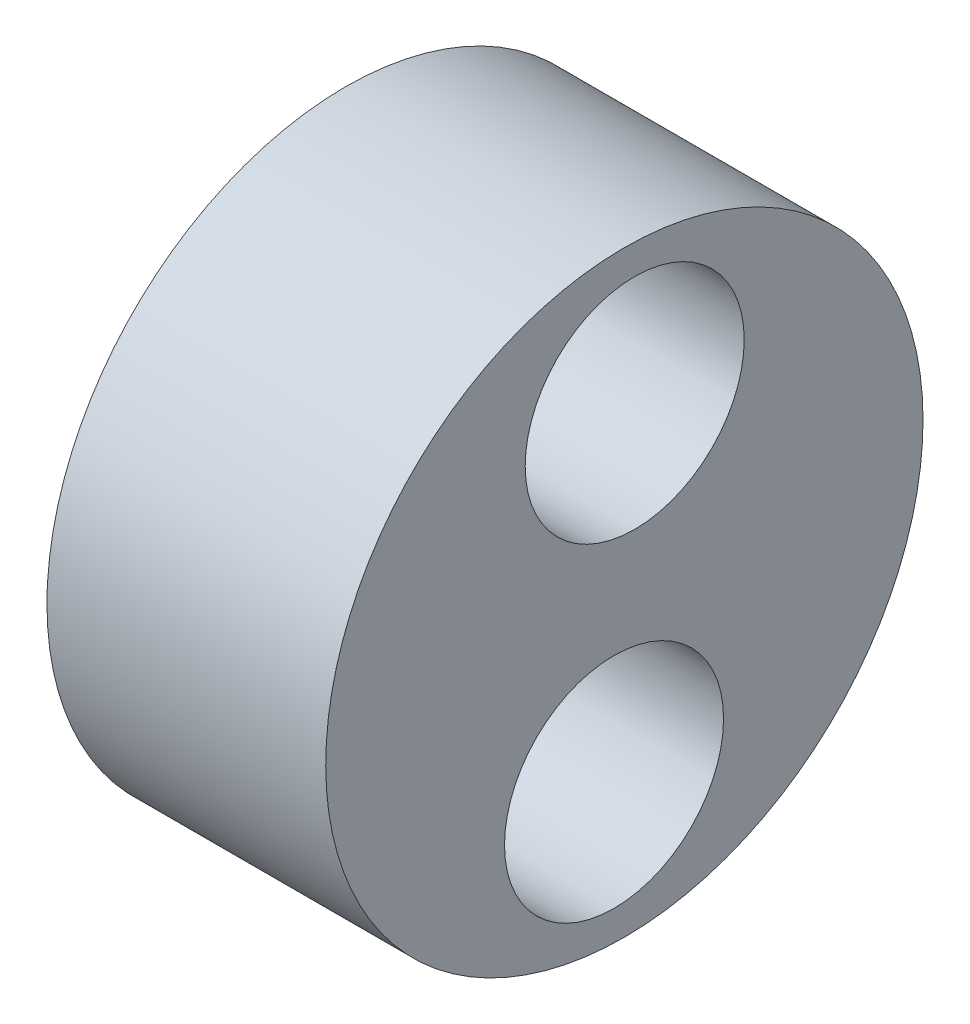
ISO-10303-21;
HEADER;
FILE_DESCRIPTION(('STEP AP214'),'2;1');
FILE_NAME('part.step','',(''),(''),'','','');
FILE_SCHEMA(('AUTOMOTIVE_DESIGN { 1 0 10303 214 1 1 1 1 }'));
ENDSEC;
DATA;
#1=APPLICATION_CONTEXT('core data for automotive mechanical design processes');
#2=APPLICATION_PROTOCOL_DEFINITION('international standard','automotive_design',2000,#1);
#3=PRODUCT_CONTEXT('',#1,'mechanical');
#4=PRODUCT('Part','Part','',(#3));
#5=PRODUCT_RELATED_PRODUCT_CATEGORY('part','',(#4));
#6=PRODUCT_DEFINITION_FORMATION('','',#4);
#7=PRODUCT_DEFINITION_CONTEXT('part definition',#1,'design');
#8=PRODUCT_DEFINITION('design','',#6,#7);
#9=PRODUCT_DEFINITION_SHAPE('','',#8);
#10=(LENGTH_UNIT() NAMED_UNIT(*) SI_UNIT(.MILLI.,.METRE.));
#11=(NAMED_UNIT(*) PLANE_ANGLE_UNIT() SI_UNIT($,.RADIAN.));
#12=(NAMED_UNIT(*) SI_UNIT($,.STERADIAN.) SOLID_ANGLE_UNIT());
#13=UNCERTAINTY_MEASURE_WITH_UNIT(LENGTH_MEASURE(1.E-05),#10,'distance_accuracy_value','');
#14=(GEOMETRIC_REPRESENTATION_CONTEXT(3) GLOBAL_UNCERTAINTY_ASSIGNED_CONTEXT((#13)) GLOBAL_UNIT_ASSIGNED_CONTEXT((#10,
#11,#12)) REPRESENTATION_CONTEXT('',''));
#15=CARTESIAN_POINT('',(0.,0.,0.));
#16=DIRECTION('',(0.,0.,1.));
#17=DIRECTION('',(1.,0.,0.));
#18=AXIS2_PLACEMENT_3D('',#15,#16,#17);
#19=CARTESIAN_POINT('',(113.025365407897,-3.99157619912642,20.7594599132244));
#20=DIRECTION('',(1.,0.,0.));
#21=DIRECTION('',(0.,-0.064864978306044,-0.997894049781517));
#22=AXIS2_PLACEMENT_3D('',#19,#20,#21);
#23=CYLINDRICAL_SURFACE('',#22,1.35);
#24=CARTESIAN_POINT('',(112.025365407897,-3.99157619912642,20.7594599132244));
#25=DIRECTION('',(-1.,0.,0.));
#26=DIRECTION('',(0.,0.,1.));
#27=AXIS2_PLACEMENT_3D('',#24,#25,#26);
#28=CIRCLE('',#27,1.35);
#29=CARTESIAN_POINT('',(112.025365407897,-3.99157619912642,22.1094599132244));
#30=VERTEX_POINT('',#29);
#31=EDGE_CURVE('E136',#30,#30,#28,.T.);
#32=ORIENTED_EDGE('',*,*,#31,.T.);
#33=EDGE_LOOP('',(#32));
#34=FACE_BOUND('',#33,.T.);
#35=CARTESIAN_POINT('',(115.025365407897,-3.99157619912642,20.7594599132244));
#36=DIRECTION('',(1.,0.,0.));
#37=DIRECTION('',(0.,0.,-1.));
#38=AXIS2_PLACEMENT_3D('',#35,#36,#37);
#39=CIRCLE('',#38,1.35);
#40=CARTESIAN_POINT('',(115.025365407897,-4.07914391983958,19.4123029460194));
#41=VERTEX_POINT('',#40);
#42=CARTESIAN_POINT('',(115.025365407897,-3.90400847841326,22.1066168804295));
#43=VERTEX_POINT('',#42);
#44=EDGE_CURVE('E11',#41,#43,#39,.F.);
#45=ORIENTED_EDGE('',*,*,#44,.F.);
#46=DIRECTION('',(1.,0.,0.));
#47=VECTOR('',#46,1.);
#48=CARTESIAN_POINT('',(113.025365407897,-4.07914391983958,19.4123029460194));
#49=LINE('',#48,#47);
#50=CARTESIAN_POINT('',(113.025365407897,-4.07914391983958,19.4123029460194));
#51=VERTEX_POINT('',#50);
#52=EDGE_CURVE('E101',#51,#41,#49,.T.);
#53=ORIENTED_EDGE('',*,*,#52,.F.);
#54=ORIENTED_EDGE('',*,*,#52,.T.);
#55=EDGE_CURVE('E49',#43,#41,#39,.F.);
#56=ORIENTED_EDGE('',*,*,#55,.F.);
#57=DIRECTION('',(1.,0.,0.));
#58=VECTOR('',#57,1.);
#59=CARTESIAN_POINT('',(113.025365407897,-3.90400847841326,22.1066168804295));
#60=LINE('',#59,#58);
#61=CARTESIAN_POINT('',(113.025365407897,-3.90400847841326,22.1066168804295));
#62=VERTEX_POINT('',#61);
#63=EDGE_CURVE('E106',#62,#43,#60,.T.);
#64=ORIENTED_EDGE('',*,*,#63,.F.);
#65=ORIENTED_EDGE('',*,*,#63,.T.);
#66=EDGE_LOOP('',(#45,#53,#54,#56,#64,#65));
#67=FACE_BOUND('',#66,.T.);
#68=ADVANCED_FACE('F46',(#34,#67),#23,.F.);
#69=CARTESIAN_POINT('',(113.025365407897,3.99157619912572,20.2405400867761));
#70=DIRECTION('',(1.,0.,0.));
#71=DIRECTION('',(0.,-0.064864978306044,-0.997894049781517));
#72=AXIS2_PLACEMENT_3D('',#69,#70,#71);
#73=CYLINDRICAL_SURFACE('',#72,1.35);
#74=CARTESIAN_POINT('',(112.025365407897,3.99157619912571,20.2405400867761));
#75=DIRECTION('',(-1.,0.,0.));
#76=DIRECTION('',(0.,0.,1.));
#77=AXIS2_PLACEMENT_3D('',#74,#75,#76);
#78=CIRCLE('',#77,1.35);
#79=CARTESIAN_POINT('',(112.025365407897,3.99157619912571,21.5905400867761));
#80=VERTEX_POINT('',#79);
#81=EDGE_CURVE('E132',#80,#80,#78,.T.);
#82=ORIENTED_EDGE('',*,*,#81,.T.);
#83=EDGE_LOOP('',(#82));
#84=FACE_BOUND('',#83,.T.);
#85=CARTESIAN_POINT('',(115.025365407897,3.99157619912572,20.2405400867761));
#86=DIRECTION('',(1.,0.,0.));
#87=DIRECTION('',(0.,0.,-1.));
#88=AXIS2_PLACEMENT_3D('',#85,#86,#87);
#89=CIRCLE('',#88,1.35);
#90=CARTESIAN_POINT('',(115.025365407897,3.90400847841256,18.893383119571));
#91=VERTEX_POINT('',#90);
#92=CARTESIAN_POINT('',(115.025365407897,4.07914391983888,21.5876970539811));
#93=VERTEX_POINT('',#92);
#94=EDGE_CURVE('E64',#91,#93,#89,.F.);
#95=ORIENTED_EDGE('',*,*,#94,.F.);
#96=DIRECTION('',(1.,0.,0.));
#97=VECTOR('',#96,1.);
#98=CARTESIAN_POINT('',(113.025365407897,3.90400847841256,18.893383119571));
#99=LINE('',#98,#97);
#100=CARTESIAN_POINT('',(113.025365407897,3.90400847841256,18.893383119571));
#101=VERTEX_POINT('',#100);
#102=EDGE_CURVE('E103',#101,#91,#99,.T.);
#103=ORIENTED_EDGE('',*,*,#102,.F.);
#104=ORIENTED_EDGE('',*,*,#102,.T.);
#105=EDGE_CURVE('E96',#93,#91,#89,.F.);
#106=ORIENTED_EDGE('',*,*,#105,.F.);
#107=DIRECTION('',(1.,0.,0.));
#108=VECTOR('',#107,1.);
#109=CARTESIAN_POINT('',(113.025365407897,4.07914391983888,21.5876970539811));
#110=LINE('',#109,#108);
#111=CARTESIAN_POINT('',(113.025365407897,4.07914391983888,21.5876970539811));
#112=VERTEX_POINT('',#111);
#113=EDGE_CURVE('E104',#112,#93,#110,.T.);
#114=ORIENTED_EDGE('',*,*,#113,.F.);
#115=ORIENTED_EDGE('',*,*,#113,.T.);
#116=EDGE_LOOP('',(#95,#103,#104,#106,#114,#115));
#117=FACE_BOUND('',#116,.T.);
#118=ADVANCED_FACE('F102',(#84,#117),#73,.F.);
#119=CARTESIAN_POINT('',(121.025365407897,-3.44148865623292E-13,20.5000000000003));
#120=DIRECTION('',(-1.,0.,0.));
#121=DIRECTION('',(0.,0.064864978306044,0.997894049781517));
#122=AXIS2_PLACEMENT_3D('',#119,#120,#121);
#123=CYLINDRICAL_SURFACE('',#122,7.5);
#124=CARTESIAN_POINT('',(112.025365407897,-3.53148865623292E-13,20.5000000000003));
#125=DIRECTION('',(-1.,0.,0.));
#126=DIRECTION('',(0.,0.,1.));
#127=AXIS2_PLACEMENT_3D('',#124,#125,#126);
#128=CIRCLE('',#127,7.5);
#129=CARTESIAN_POINT('',(112.025365407897,-3.53148865623292E-13,28.0000000000003));
#130=VERTEX_POINT('',#129);
#131=EDGE_CURVE('E130',#130,#130,#128,.F.);
#132=ORIENTED_EDGE('',*,*,#131,.T.);
#133=EDGE_LOOP('',(#132));
#134=FACE_BOUND('',#133,.T.);
#135=DIRECTION('',(-1.,0.,0.));
#136=VECTOR('',#135,1.);
#137=CARTESIAN_POINT('',(121.025365407897,-0.486487337295673,13.0157946266389));
#138=LINE('',#137,#136);
#139=CARTESIAN_POINT('',(119.025365407897,-0.486487337295675,13.0157946266389));
#140=VERTEX_POINT('',#139);
#141=CARTESIAN_POINT('',(115.025365407897,-0.486487337295676,13.0157946266389));
#142=VERTEX_POINT('',#141);
#143=EDGE_CURVE('E117',#140,#142,#138,.T.);
#144=ORIENTED_EDGE('',*,*,#143,.F.);
#145=CARTESIAN_POINT('',(119.025365407897,-3.46148865623292E-13,20.5000000000003));
#146=DIRECTION('',(1.,0.,0.));
#147=DIRECTION('',(0.,0.,-1.));
#148=AXIS2_PLACEMENT_3D('',#145,#146,#147);
#149=CIRCLE('',#148,7.5);
#150=CARTESIAN_POINT('',(119.025365407897,0.486487337294983,27.9842053733616));
#151=VERTEX_POINT('',#150);
#152=EDGE_CURVE('E141',#151,#140,#149,.T.);
#153=ORIENTED_EDGE('',*,*,#152,.F.);
#154=DIRECTION('',(-1.,0.,0.));
#155=VECTOR('',#154,1.);
#156=CARTESIAN_POINT('',(121.025365407897,0.486487337294986,27.9842053733616));
#157=LINE('',#156,#155);
#158=CARTESIAN_POINT('',(115.025365407897,0.48648733729498,27.9842053733616));
#159=VERTEX_POINT('',#158);
#160=EDGE_CURVE('E113',#151,#159,#157,.T.);
#161=ORIENTED_EDGE('',*,*,#160,.T.);
#162=ORIENTED_EDGE('',*,*,#160,.F.);
#163=EDGE_CURVE('E151',#140,#151,#149,.T.);
#164=ORIENTED_EDGE('',*,*,#163,.F.);
#165=ORIENTED_EDGE('',*,*,#143,.T.);
#166=EDGE_LOOP('',(#144,#153,#161,#162,#164,#165));
#167=FACE_BOUND('',#166,.T.);
#168=ADVANCED_FACE('F148',(#134,#167),#123,.T.);
#169=CARTESIAN_POINT('',(112.025365407897,-3.53148865623292E-13,20.5000000000003));
#170=DIRECTION('',(-1.,0.,0.));
#171=DIRECTION('',(0.,0.,1.));
#172=AXIS2_PLACEMENT_3D('',#169,#170,#171);
#173=PLANE('',#172);
#174=ORIENTED_EDGE('',*,*,#131,.F.);
#175=EDGE_LOOP('',(#174));
#176=FACE_BOUND('',#175,.T.);
#177=ORIENTED_EDGE('',*,*,#31,.F.);
#178=EDGE_LOOP('',(#177));
#179=FACE_BOUND('',#178,.T.);
#180=ORIENTED_EDGE('',*,*,#81,.F.);
#181=EDGE_LOOP('',(#180));
#182=FACE_BOUND('',#181,.T.);
#183=ADVANCED_FACE('F177',(#176,#179,#182),#173,.T.);
#184=CARTESIAN_POINT('',(119.025365407897,-3.46148865623292E-13,20.5000000000003));
#185=DIRECTION('',(1.,0.,0.));
#186=DIRECTION('',(0.,0.,-1.));
#187=AXIS2_PLACEMENT_3D('',#184,#185,#186);
#188=PLANE('',#187);
#189=CARTESIAN_POINT('',(119.025365407897,3.99157619912572,20.2405400867761));
#190=DIRECTION('',(1.,0.,0.));
#191=DIRECTION('',(0.,0.,-1.));
#192=AXIS2_PLACEMENT_3D('',#189,#190,#191);
#193=CIRCLE('',#192,2.75);
#194=CARTESIAN_POINT('',(119.025365407897,3.99157619912572,17.4905400867761));
#195=VERTEX_POINT('',#194);
#196=EDGE_CURVE('E160',#195,#195,#193,.T.);
#197=ORIENTED_EDGE('',*,*,#196,.F.);
#198=EDGE_LOOP('',(#197));
#199=FACE_BOUND('',#198,.T.);
#200=CARTESIAN_POINT('',(119.025365407897,-3.99157619912641,20.7594599132244));
#201=DIRECTION('',(1.,0.,0.));
#202=DIRECTION('',(0.,0.,-1.));
#203=AXIS2_PLACEMENT_3D('',#200,#201,#202);
#204=CIRCLE('',#203,2.75);
#205=CARTESIAN_POINT('',(119.025365407897,-3.99157619912641,18.0094599132244));
#206=VERTEX_POINT('',#205);
#207=EDGE_CURVE('E157',#206,#206,#204,.T.);
#208=ORIENTED_EDGE('',*,*,#207,.F.);
#209=EDGE_LOOP('',(#208));
#210=FACE_BOUND('',#209,.T.);
#211=ORIENTED_EDGE('',*,*,#152,.T.);
#212=ORIENTED_EDGE('',*,*,#163,.T.);
#213=EDGE_LOOP('',(#211,#212));
#214=FACE_BOUND('',#213,.T.);
#215=ADVANCED_FACE('F173',(#199,#210,#214),#188,.T.);
#216=CARTESIAN_POINT('',(115.025365407897,-3.99157619912642,20.7594599132244));
#217=DIRECTION('',(1.,0.,0.));
#218=DIRECTION('',(0.,0.,-1.));
#219=AXIS2_PLACEMENT_3D('',#216,#217,#218);
#220=PLANE('',#219);
#221=CARTESIAN_POINT('',(115.025365407897,-3.99157619912642,20.7594599132244));
#222=DIRECTION('',(1.,0.,0.));
#223=DIRECTION('',(0.,0.,-1.));
#224=AXIS2_PLACEMENT_3D('',#221,#222,#223);
#225=CIRCLE('',#224,2.75);
#226=CARTESIAN_POINT('',(115.025365407897,-3.99157619912642,18.0094599132244));
#227=VERTEX_POINT('',#226);
#228=EDGE_CURVE('E154',#227,#227,#225,.T.);
#229=ORIENTED_EDGE('',*,*,#228,.T.);
#230=EDGE_LOOP('',(#229));
#231=FACE_BOUND('',#230,.T.);
#232=ORIENTED_EDGE('',*,*,#44,.T.);
#233=ORIENTED_EDGE('',*,*,#55,.T.);
#234=EDGE_LOOP('',(#232,#233));
#235=FACE_BOUND('',#234,.T.);
#236=ADVANCED_FACE('F176',(#231,#235),#220,.T.);
#237=CARTESIAN_POINT('',(115.025365407897,-3.99157619912642,20.7594599132244));
#238=DIRECTION('',(1.,0.,0.));
#239=DIRECTION('',(0.,0.,-1.));
#240=AXIS2_PLACEMENT_3D('',#237,#238,#239);
#241=CYLINDRICAL_SURFACE('',#240,2.75);
#242=ORIENTED_EDGE('',*,*,#228,.F.);
#243=EDGE_LOOP('',(#242));
#244=FACE_BOUND('',#243,.T.);
#245=ORIENTED_EDGE('',*,*,#207,.T.);
#246=EDGE_LOOP('',(#245));
#247=FACE_BOUND('',#246,.T.);
#248=ADVANCED_FACE('F181',(#244,#247),#241,.F.);
#249=CARTESIAN_POINT('',(115.025365407897,3.99157619912572,20.2405400867761));
#250=DIRECTION('',(1.,0.,0.));
#251=DIRECTION('',(0.,0.,-1.));
#252=AXIS2_PLACEMENT_3D('',#249,#250,#251);
#253=PLANE('',#252);
#254=CARTESIAN_POINT('',(115.025365407897,3.99157619912572,20.2405400867761));
#255=DIRECTION('',(1.,0.,0.));
#256=DIRECTION('',(0.,0.,-1.));
#257=AXIS2_PLACEMENT_3D('',#254,#255,#256);
#258=CIRCLE('',#257,2.75);
#259=CARTESIAN_POINT('',(115.025365407897,3.99157619912572,17.4905400867761));
#260=VERTEX_POINT('',#259);
#261=EDGE_CURVE('E152',#260,#260,#258,.T.);
#262=ORIENTED_EDGE('',*,*,#261,.T.);
#263=EDGE_LOOP('',(#262));
#264=FACE_BOUND('',#263,.T.);
#265=ORIENTED_EDGE('',*,*,#94,.T.);
#266=ORIENTED_EDGE('',*,*,#105,.T.);
#267=EDGE_LOOP('',(#265,#266));
#268=FACE_BOUND('',#267,.T.);
#269=ADVANCED_FACE('F97',(#264,#268),#253,.T.);
#270=CARTESIAN_POINT('',(115.025365407897,3.99157619912572,20.2405400867761));
#271=DIRECTION('',(1.,0.,0.));
#272=DIRECTION('',(0.,0.,-1.));
#273=AXIS2_PLACEMENT_3D('',#270,#271,#272);
#274=CYLINDRICAL_SURFACE('',#273,2.75);
#275=ORIENTED_EDGE('',*,*,#261,.F.);
#276=EDGE_LOOP('',(#275));
#277=FACE_BOUND('',#276,.T.);
#278=ORIENTED_EDGE('',*,*,#196,.T.);
#279=EDGE_LOOP('',(#278));
#280=FACE_BOUND('',#279,.T.);
#281=ADVANCED_FACE('F167',(#277,#280),#274,.F.);
#282=CLOSED_SHELL('',(#68,#118,#168,#183,#215,#236,#248,#269,#281));
#283=MANIFOLD_SOLID_BREP('B2',#282);
#284=ADVANCED_BREP_SHAPE_REPRESENTATION('',(#18,#283),#14);
#285=SHAPE_DEFINITION_REPRESENTATION(#9,#284);
ENDSEC;
END-ISO-10303-21;
